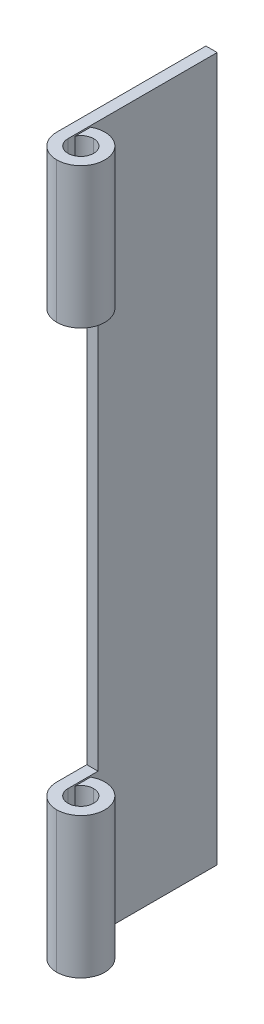
ISO-10303-21;
HEADER;
FILE_DESCRIPTION(('STEP AP214'),'2;1');
FILE_NAME('part.step','',(''),(''),'','','');
FILE_SCHEMA(('AUTOMOTIVE_DESIGN { 1 0 10303 214 1 1 1 1 }'));
ENDSEC;
DATA;
#1=APPLICATION_CONTEXT('core data for automotive mechanical design processes');
#2=APPLICATION_PROTOCOL_DEFINITION('international standard','automotive_design',2000,#1);
#3=PRODUCT_CONTEXT('',#1,'mechanical');
#4=PRODUCT('Part','Part','',(#3));
#5=PRODUCT_RELATED_PRODUCT_CATEGORY('part','',(#4));
#6=PRODUCT_DEFINITION_FORMATION('','',#4);
#7=PRODUCT_DEFINITION_CONTEXT('part definition',#1,'design');
#8=PRODUCT_DEFINITION('design','',#6,#7);
#9=PRODUCT_DEFINITION_SHAPE('','',#8);
#10=(LENGTH_UNIT() NAMED_UNIT(*) SI_UNIT(.MILLI.,.METRE.));
#11=(NAMED_UNIT(*) PLANE_ANGLE_UNIT() SI_UNIT($,.RADIAN.));
#12=(NAMED_UNIT(*) SI_UNIT($,.STERADIAN.) SOLID_ANGLE_UNIT());
#13=UNCERTAINTY_MEASURE_WITH_UNIT(LENGTH_MEASURE(1.E-05),#10,'distance_accuracy_value','');
#14=(GEOMETRIC_REPRESENTATION_CONTEXT(3) GLOBAL_UNCERTAINTY_ASSIGNED_CONTEXT((#13)) GLOBAL_UNIT_ASSIGNED_CONTEXT((#10,
#11,#12)) REPRESENTATION_CONTEXT('',''));
#15=CARTESIAN_POINT('',(0.,0.,0.));
#16=DIRECTION('',(0.,0.,1.));
#17=DIRECTION('',(1.,0.,0.));
#18=AXIS2_PLACEMENT_3D('',#15,#16,#17);
#19=CARTESIAN_POINT('',(4.3434,12.7,2.71018));
#20=DIRECTION('',(0.,1.,0.));
#21=DIRECTION('',(0.,0.,-1.));
#22=AXIS2_PLACEMENT_3D('',#19,#20,#21);
#23=PLANE('',#22);
#24=CARTESIAN_POINT('',(2.1717,12.7,0.));
#25=DIRECTION('',(0.,1.,0.));
#26=DIRECTION('',(0.,0.,1.));
#27=AXIS2_PLACEMENT_3D('',#24,#25,#26);
#28=CIRCLE('',#27,2.1717);
#29=CARTESIAN_POINT('',(0.,12.7,0.));
#30=VERTEX_POINT('',#29);
#31=CARTESIAN_POINT('',(2.1717,12.7,2.1717));
#32=VERTEX_POINT('',#31);
#33=EDGE_CURVE('E323',#30,#32,#28,.T.);
#34=ORIENTED_EDGE('',*,*,#33,.T.);
#35=CARTESIAN_POINT('',(2.1717,12.7,0.));
#36=DIRECTION('',(0.,1.,0.));
#37=DIRECTION('',(0.,0.,1.));
#38=AXIS2_PLACEMENT_3D('',#35,#36,#37);
#39=CIRCLE('',#38,2.1717);
#40=CARTESIAN_POINT('',(2.1717,12.7,-2.1717));
#41=VERTEX_POINT('',#40);
#42=EDGE_CURVE('E268',#32,#41,#39,.T.);
#43=ORIENTED_EDGE('',*,*,#42,.T.);
#44=CARTESIAN_POINT('',(2.1717,12.7,0.));
#45=DIRECTION('',(0.,1.,0.));
#46=DIRECTION('',(0.,0.,1.));
#47=AXIS2_PLACEMENT_3D('',#44,#45,#46);
#48=CIRCLE('',#47,2.1717);
#49=CARTESIAN_POINT('',(1.143,12.7,-1.9126048206569));
#50=VERTEX_POINT('',#49);
#51=EDGE_CURVE('E433',#41,#50,#48,.T.);
#52=ORIENTED_EDGE('',*,*,#51,.T.);
#53=DIRECTION('',(0.,0.,1.));
#54=VECTOR('',#53,1.);
#55=CARTESIAN_POINT('',(1.143,12.7,-1.91260482065692));
#56=LINE('',#55,#54);
#57=CARTESIAN_POINT('',(1.143,12.7,-0.526705610374527));
#58=VERTEX_POINT('',#57);
#59=EDGE_CURVE('E479',#50,#58,#56,.T.);
#60=ORIENTED_EDGE('',*,*,#59,.T.);
#61=CARTESIAN_POINT('',(2.1717,12.7,0.));
#62=DIRECTION('',(0.,-1.,0.));
#63=DIRECTION('',(0.,0.,1.));
#64=AXIS2_PLACEMENT_3D('',#61,#62,#63);
#65=CIRCLE('',#64,1.1557);
#66=CARTESIAN_POINT('',(2.1717,12.7,-1.1557));
#67=VERTEX_POINT('',#66);
#68=EDGE_CURVE('E225',#58,#67,#65,.T.);
#69=ORIENTED_EDGE('',*,*,#68,.T.);
#70=CARTESIAN_POINT('',(2.1717,12.7,0.));
#71=DIRECTION('',(0.,-1.,0.));
#72=DIRECTION('',(0.,0.,1.));
#73=AXIS2_PLACEMENT_3D('',#70,#71,#72);
#74=CIRCLE('',#73,1.1557);
#75=CARTESIAN_POINT('',(2.1717,12.7,1.1557));
#76=VERTEX_POINT('',#75);
#77=EDGE_CURVE('E239',#67,#76,#74,.T.);
#78=ORIENTED_EDGE('',*,*,#77,.T.);
#79=CARTESIAN_POINT('',(2.1717,12.7,0.));
#80=DIRECTION('',(0.,-1.,0.));
#81=DIRECTION('',(0.,0.,1.));
#82=AXIS2_PLACEMENT_3D('',#79,#80,#81);
#83=CIRCLE('',#82,1.1557);
#84=CARTESIAN_POINT('',(1.016,12.7,0.));
#85=VERTEX_POINT('',#84);
#86=EDGE_CURVE('E332',#76,#85,#83,.T.);
#87=ORIENTED_EDGE('',*,*,#86,.T.);
#88=DIRECTION('',(0.,0.,-1.));
#89=VECTOR('',#88,1.);
#90=CARTESIAN_POINT('',(1.016,12.7,-13.462));
#91=LINE('',#90,#89);
#92=CARTESIAN_POINT('',(1.016,12.7,-2.71018));
#93=VERTEX_POINT('',#92);
#94=EDGE_CURVE('E331',#85,#93,#91,.T.);
#95=ORIENTED_EDGE('',*,*,#94,.T.);
#96=DIRECTION('',(-1.,0.,0.));
#97=VECTOR('',#96,1.);
#98=CARTESIAN_POINT('',(4.3434,12.7,-2.71018));
#99=LINE('',#98,#97);
#100=CARTESIAN_POINT('',(0.,12.7,-2.71018));
#101=VERTEX_POINT('',#100);
#102=EDGE_CURVE('E11',#93,#101,#99,.T.);
#103=ORIENTED_EDGE('',*,*,#102,.T.);
#104=DIRECTION('',(0.,0.,-1.));
#105=VECTOR('',#104,1.);
#106=CARTESIAN_POINT('',(0.,12.7,2.71018));
#107=LINE('',#106,#105);
#108=EDGE_CURVE('E425',#30,#101,#107,.T.);
#109=ORIENTED_EDGE('',*,*,#108,.F.);
#110=EDGE_LOOP('',(#34,#43,#52,#60,#69,#78,#87,#95,#103,#109));
#111=FACE_BOUND('',#110,.T.);
#112=ADVANCED_FACE('F38',(#111),#23,.T.);
#113=CARTESIAN_POINT('',(4.3434,25.4,-2.71018));
#114=DIRECTION('',(0.,0.,1.));
#115=DIRECTION('',(0.,-1.,0.));
#116=AXIS2_PLACEMENT_3D('',#113,#114,#115);
#117=PLANE('',#116);
#118=DIRECTION('',(0.,1.,0.));
#119=VECTOR('',#118,1.);
#120=CARTESIAN_POINT('',(1.016,63.5,-2.71018));
#121=LINE('',#120,#119);
#122=CARTESIAN_POINT('',(1.016,50.8,-2.71018));
#123=VERTEX_POINT('',#122);
#124=EDGE_CURVE('E327',#93,#123,#121,.T.);
#125=ORIENTED_EDGE('',*,*,#124,.T.);
#126=DIRECTION('',(-1.,0.,0.));
#127=VECTOR('',#126,1.);
#128=CARTESIAN_POINT('',(4.3434,50.8,-2.71018));
#129=LINE('',#128,#127);
#130=CARTESIAN_POINT('',(0.,50.8,-2.71018));
#131=VERTEX_POINT('',#130);
#132=EDGE_CURVE('E49',#123,#131,#129,.T.);
#133=ORIENTED_EDGE('',*,*,#132,.T.);
#134=DIRECTION('',(0.,1.,0.));
#135=VECTOR('',#134,1.);
#136=CARTESIAN_POINT('',(0.,25.4,-2.71018));
#137=LINE('',#136,#135);
#138=EDGE_CURVE('E326',#101,#131,#137,.T.);
#139=ORIENTED_EDGE('',*,*,#138,.F.);
#140=ORIENTED_EDGE('',*,*,#102,.F.);
#141=EDGE_LOOP('',(#125,#133,#139,#140));
#142=FACE_BOUND('',#141,.T.);
#143=ADVANCED_FACE('F383',(#142),#117,.T.);
#144=CARTESIAN_POINT('',(4.3434,50.8,2.71018));
#145=DIRECTION('',(0.,-1.,0.));
#146=DIRECTION('',(0.,0.,-1.));
#147=AXIS2_PLACEMENT_3D('',#144,#145,#146);
#148=PLANE('',#147);
#149=DIRECTION('',(0.,0.,1.));
#150=VECTOR('',#149,1.);
#151=CARTESIAN_POINT('',(1.016,50.8,-13.462));
#152=LINE('',#151,#150);
#153=CARTESIAN_POINT('',(1.016,50.8,0.));
#154=VERTEX_POINT('',#153);
#155=EDGE_CURVE('E273',#123,#154,#152,.T.);
#156=ORIENTED_EDGE('',*,*,#155,.T.);
#157=CARTESIAN_POINT('',(2.1717,50.8,0.));
#158=DIRECTION('',(0.,1.,0.));
#159=DIRECTION('',(0.,0.,-1.));
#160=AXIS2_PLACEMENT_3D('',#157,#158,#159);
#161=CIRCLE('',#160,1.1557);
#162=CARTESIAN_POINT('',(2.1717,50.8,1.1557));
#163=VERTEX_POINT('',#162);
#164=EDGE_CURVE('E278',#154,#163,#161,.T.);
#165=ORIENTED_EDGE('',*,*,#164,.T.);
#166=CARTESIAN_POINT('',(2.1717,50.8,0.));
#167=DIRECTION('',(0.,1.,0.));
#168=DIRECTION('',(0.,0.,-1.));
#169=AXIS2_PLACEMENT_3D('',#166,#167,#168);
#170=CIRCLE('',#169,1.1557);
#171=CARTESIAN_POINT('',(2.1717,50.8,-1.1557));
#172=VERTEX_POINT('',#171);
#173=EDGE_CURVE('E337',#163,#172,#170,.T.);
#174=ORIENTED_EDGE('',*,*,#173,.T.);
#175=CARTESIAN_POINT('',(2.1717,50.8,0.));
#176=DIRECTION('',(0.,1.,0.));
#177=DIRECTION('',(0.,0.,-1.));
#178=AXIS2_PLACEMENT_3D('',#175,#176,#177);
#179=CIRCLE('',#178,1.1557);
#180=CARTESIAN_POINT('',(1.143,50.8,-0.526705610374527));
#181=VERTEX_POINT('',#180);
#182=EDGE_CURVE('E262',#172,#181,#179,.T.);
#183=ORIENTED_EDGE('',*,*,#182,.T.);
#184=DIRECTION('',(0.,0.,-1.));
#185=VECTOR('',#184,1.);
#186=CARTESIAN_POINT('',(1.143,50.8,-1.9126048206569));
#187=LINE('',#186,#185);
#188=CARTESIAN_POINT('',(1.143,50.8,-1.9126048206569));
#189=VERTEX_POINT('',#188);
#190=EDGE_CURVE('E345',#181,#189,#187,.T.);
#191=ORIENTED_EDGE('',*,*,#190,.T.);
#192=CARTESIAN_POINT('',(2.1717,50.8,0.));
#193=DIRECTION('',(0.,-1.,0.));
#194=DIRECTION('',(0.,0.,-1.));
#195=AXIS2_PLACEMENT_3D('',#192,#193,#194);
#196=CIRCLE('',#195,2.1717);
#197=CARTESIAN_POINT('',(2.1717,50.8,-2.1717));
#198=VERTEX_POINT('',#197);
#199=EDGE_CURVE('E269',#189,#198,#196,.T.);
#200=ORIENTED_EDGE('',*,*,#199,.T.);
#201=CARTESIAN_POINT('',(2.1717,50.8,0.));
#202=DIRECTION('',(0.,-1.,0.));
#203=DIRECTION('',(0.,0.,-1.));
#204=AXIS2_PLACEMENT_3D('',#201,#202,#203);
#205=CIRCLE('',#204,2.1717);
#206=CARTESIAN_POINT('',(2.1717,50.8,2.1717));
#207=VERTEX_POINT('',#206);
#208=EDGE_CURVE('E306',#198,#207,#205,.T.);
#209=ORIENTED_EDGE('',*,*,#208,.T.);
#210=CARTESIAN_POINT('',(2.1717,50.8,0.));
#211=DIRECTION('',(0.,-1.,0.));
#212=DIRECTION('',(0.,0.,-1.));
#213=AXIS2_PLACEMENT_3D('',#210,#211,#212);
#214=CIRCLE('',#213,2.1717);
#215=CARTESIAN_POINT('',(0.,50.8,0.));
#216=VERTEX_POINT('',#215);
#217=EDGE_CURVE('E350',#207,#216,#214,.T.);
#218=ORIENTED_EDGE('',*,*,#217,.T.);
#219=DIRECTION('',(0.,0.,1.));
#220=VECTOR('',#219,1.);
#221=CARTESIAN_POINT('',(0.,50.8,2.71018));
#222=LINE('',#221,#220);
#223=EDGE_CURVE('E498',#131,#216,#222,.T.);
#224=ORIENTED_EDGE('',*,*,#223,.F.);
#225=ORIENTED_EDGE('',*,*,#132,.F.);
#226=EDGE_LOOP('',(#156,#165,#174,#183,#191,#200,#209,#218,#224,#225));
#227=FACE_BOUND('',#226,.T.);
#228=ADVANCED_FACE('F359',(#227),#148,.T.);
#229=CARTESIAN_POINT('',(2.1717,0.,0.));
#230=DIRECTION('',(0.,1.,0.));
#231=DIRECTION('',(1.,0.,0.));
#232=AXIS2_PLACEMENT_3D('',#229,#230,#231);
#233=PLANE('',#232);
#234=DIRECTION('',(0.,0.,-1.));
#235=VECTOR('',#234,1.);
#236=CARTESIAN_POINT('',(1.016,0.,-13.462));
#237=LINE('',#236,#235);
#238=CARTESIAN_POINT('',(1.016,0.,0.));
#239=VERTEX_POINT('',#238);
#240=CARTESIAN_POINT('',(1.016,0.,-13.462));
#241=VERTEX_POINT('',#240);
#242=EDGE_CURVE('E260',#239,#241,#237,.T.);
#243=ORIENTED_EDGE('',*,*,#242,.F.);
#244=CARTESIAN_POINT('',(2.1717,0.,0.));
#245=DIRECTION('',(0.,-1.,0.));
#246=DIRECTION('',(0.,0.,1.));
#247=AXIS2_PLACEMENT_3D('',#244,#245,#246);
#248=CIRCLE('',#247,1.1557);
#249=CARTESIAN_POINT('',(2.1717,0.,1.1557));
#250=VERTEX_POINT('',#249);
#251=EDGE_CURVE('E231',#250,#239,#248,.T.);
#252=ORIENTED_EDGE('',*,*,#251,.F.);
#253=CARTESIAN_POINT('',(2.1717,0.,0.));
#254=DIRECTION('',(0.,-1.,0.));
#255=DIRECTION('',(0.,0.,1.));
#256=AXIS2_PLACEMENT_3D('',#253,#254,#255);
#257=CIRCLE('',#256,1.1557);
#258=CARTESIAN_POINT('',(2.1717,0.,-1.1557));
#259=VERTEX_POINT('',#258);
#260=EDGE_CURVE('E228',#259,#250,#257,.T.);
#261=ORIENTED_EDGE('',*,*,#260,.F.);
#262=CARTESIAN_POINT('',(2.1717,0.,0.));
#263=DIRECTION('',(0.,-1.,0.));
#264=DIRECTION('',(0.,0.,1.));
#265=AXIS2_PLACEMENT_3D('',#262,#263,#264);
#266=CIRCLE('',#265,1.1557);
#267=CARTESIAN_POINT('',(1.143,0.,-0.526705610374527));
#268=VERTEX_POINT('',#267);
#269=EDGE_CURVE('E214',#268,#259,#266,.T.);
#270=ORIENTED_EDGE('',*,*,#269,.F.);
#271=DIRECTION('',(0.,0.,1.));
#272=VECTOR('',#271,1.);
#273=CARTESIAN_POINT('',(1.143,0.,-1.9126048206569));
#274=LINE('',#273,#272);
#275=CARTESIAN_POINT('',(1.143,0.,-1.9126048206569));
#276=VERTEX_POINT('',#275);
#277=EDGE_CURVE('E346',#276,#268,#274,.T.);
#278=ORIENTED_EDGE('',*,*,#277,.F.);
#279=CARTESIAN_POINT('',(2.1717,0.,0.));
#280=DIRECTION('',(0.,1.,0.));
#281=DIRECTION('',(0.,0.,1.));
#282=AXIS2_PLACEMENT_3D('',#279,#280,#281);
#283=CIRCLE('',#282,2.1717);
#284=CARTESIAN_POINT('',(2.1717,0.,-2.1717));
#285=VERTEX_POINT('',#284);
#286=EDGE_CURVE('E274',#285,#276,#283,.T.);
#287=ORIENTED_EDGE('',*,*,#286,.F.);
#288=CARTESIAN_POINT('',(2.1717,0.,0.));
#289=DIRECTION('',(0.,1.,0.));
#290=DIRECTION('',(0.,0.,1.));
#291=AXIS2_PLACEMENT_3D('',#288,#289,#290);
#292=CIRCLE('',#291,2.1717);
#293=CARTESIAN_POINT('',(2.1717,0.,2.1717));
#294=VERTEX_POINT('',#293);
#295=EDGE_CURVE('E434',#294,#285,#292,.T.);
#296=ORIENTED_EDGE('',*,*,#295,.F.);
#297=CARTESIAN_POINT('',(2.1717,0.,0.));
#298=DIRECTION('',(0.,1.,0.));
#299=DIRECTION('',(0.,0.,1.));
#300=AXIS2_PLACEMENT_3D('',#297,#298,#299);
#301=CIRCLE('',#300,2.1717);
#302=CARTESIAN_POINT('',(0.,0.,0.));
#303=VERTEX_POINT('',#302);
#304=EDGE_CURVE('E321',#303,#294,#301,.T.);
#305=ORIENTED_EDGE('',*,*,#304,.F.);
#306=DIRECTION('',(0.,0.,1.));
#307=VECTOR('',#306,1.);
#308=CARTESIAN_POINT('',(0.,0.,-13.462));
#309=LINE('',#308,#307);
#310=CARTESIAN_POINT('',(0.,0.,-13.462));
#311=VERTEX_POINT('',#310);
#312=EDGE_CURVE('E319',#311,#303,#309,.T.);
#313=ORIENTED_EDGE('',*,*,#312,.F.);
#314=DIRECTION('',(-1.,0.,0.));
#315=VECTOR('',#314,1.);
#316=CARTESIAN_POINT('',(1.016,0.,-13.462));
#317=LINE('',#316,#315);
#318=EDGE_CURVE('E298',#241,#311,#317,.T.);
#319=ORIENTED_EDGE('',*,*,#318,.F.);
#320=EDGE_LOOP('',(#243,#252,#261,#270,#278,#287,#296,#305,#313,#319));
#321=FACE_BOUND('',#320,.T.);
#322=ADVANCED_FACE('F229',(#321),#233,.F.);
#323=CARTESIAN_POINT('',(2.1717,63.5,0.));
#324=DIRECTION('',(0.,1.,0.));
#325=DIRECTION('',(1.,0.,0.));
#326=AXIS2_PLACEMENT_3D('',#323,#324,#325);
#327=PLANE('',#326);
#328=DIRECTION('',(0.,0.,1.));
#329=VECTOR('',#328,1.);
#330=CARTESIAN_POINT('',(0.,63.5,-13.462));
#331=LINE('',#330,#329);
#332=CARTESIAN_POINT('',(0.,63.5,-13.462));
#333=VERTEX_POINT('',#332);
#334=CARTESIAN_POINT('',(0.,63.5,0.));
#335=VERTEX_POINT('',#334);
#336=EDGE_CURVE('E42',#333,#335,#331,.T.);
#337=ORIENTED_EDGE('',*,*,#336,.T.);
#338=CARTESIAN_POINT('',(2.1717,63.5,0.));
#339=DIRECTION('',(0.,1.,0.));
#340=DIRECTION('',(0.,0.,1.));
#341=AXIS2_PLACEMENT_3D('',#338,#339,#340);
#342=CIRCLE('',#341,2.1717);
#343=CARTESIAN_POINT('',(2.1717,63.5,2.1717));
#344=VERTEX_POINT('',#343);
#345=EDGE_CURVE('E207',#335,#344,#342,.T.);
#346=ORIENTED_EDGE('',*,*,#345,.T.);
#347=CARTESIAN_POINT('',(2.1717,63.5,0.));
#348=DIRECTION('',(0.,1.,0.));
#349=DIRECTION('',(0.,0.,1.));
#350=AXIS2_PLACEMENT_3D('',#347,#348,#349);
#351=CIRCLE('',#350,2.1717);
#352=CARTESIAN_POINT('',(2.1717,63.5,-2.1717));
#353=VERTEX_POINT('',#352);
#354=EDGE_CURVE('E236',#344,#353,#351,.T.);
#355=ORIENTED_EDGE('',*,*,#354,.T.);
#356=CARTESIAN_POINT('',(2.1717,63.5,0.));
#357=DIRECTION('',(0.,1.,0.));
#358=DIRECTION('',(0.,0.,1.));
#359=AXIS2_PLACEMENT_3D('',#356,#357,#358);
#360=CIRCLE('',#359,2.1717);
#361=CARTESIAN_POINT('',(1.143,63.5,-1.9126048206569));
#362=VERTEX_POINT('',#361);
#363=EDGE_CURVE('E411',#353,#362,#360,.T.);
#364=ORIENTED_EDGE('',*,*,#363,.T.);
#365=DIRECTION('',(0.,0.,1.));
#366=VECTOR('',#365,1.);
#367=CARTESIAN_POINT('',(1.143,63.5,-1.9126048206569));
#368=LINE('',#367,#366);
#369=CARTESIAN_POINT('',(1.143,63.5,-0.526705610374527));
#370=VERTEX_POINT('',#369);
#371=EDGE_CURVE('E252',#362,#370,#368,.T.);
#372=ORIENTED_EDGE('',*,*,#371,.T.);
#373=CARTESIAN_POINT('',(2.1717,63.5,0.));
#374=DIRECTION('',(0.,-1.,0.));
#375=DIRECTION('',(0.,0.,1.));
#376=AXIS2_PLACEMENT_3D('',#373,#374,#375);
#377=CIRCLE('',#376,1.1557);
#378=CARTESIAN_POINT('',(2.1717,63.5,-1.1557));
#379=VERTEX_POINT('',#378);
#380=EDGE_CURVE('E62',#370,#379,#377,.T.);
#381=ORIENTED_EDGE('',*,*,#380,.T.);
#382=CARTESIAN_POINT('',(2.1717,63.5,0.));
#383=DIRECTION('',(0.,-1.,0.));
#384=DIRECTION('',(0.,0.,1.));
#385=AXIS2_PLACEMENT_3D('',#382,#383,#384);
#386=CIRCLE('',#385,1.1557);
#387=CARTESIAN_POINT('',(2.1717,63.5,1.1557));
#388=VERTEX_POINT('',#387);
#389=EDGE_CURVE('E368',#379,#388,#386,.T.);
#390=ORIENTED_EDGE('',*,*,#389,.T.);
#391=CARTESIAN_POINT('',(2.1717,63.5,0.));
#392=DIRECTION('',(0.,-1.,0.));
#393=DIRECTION('',(0.,0.,1.));
#394=AXIS2_PLACEMENT_3D('',#391,#392,#393);
#395=CIRCLE('',#394,1.1557);
#396=CARTESIAN_POINT('',(1.016,63.5,0.));
#397=VERTEX_POINT('',#396);
#398=EDGE_CURVE('E279',#388,#397,#395,.T.);
#399=ORIENTED_EDGE('',*,*,#398,.T.);
#400=DIRECTION('',(0.,0.,-1.));
#401=VECTOR('',#400,1.);
#402=CARTESIAN_POINT('',(1.016,63.5,-13.462));
#403=LINE('',#402,#401);
#404=CARTESIAN_POINT('',(1.016,63.5,-13.462));
#405=VERTEX_POINT('',#404);
#406=EDGE_CURVE('E259',#397,#405,#403,.T.);
#407=ORIENTED_EDGE('',*,*,#406,.T.);
#408=DIRECTION('',(-1.,0.,0.));
#409=VECTOR('',#408,1.);
#410=CARTESIAN_POINT('',(1.016,63.5,-13.462));
#411=LINE('',#410,#409);
#412=EDGE_CURVE('E250',#405,#333,#411,.T.);
#413=ORIENTED_EDGE('',*,*,#412,.T.);
#414=EDGE_LOOP('',(#337,#346,#355,#364,#372,#381,#390,#399,#407,#413));
#415=FACE_BOUND('',#414,.T.);
#416=ADVANCED_FACE('F393',(#415),#327,.T.);
#417=CARTESIAN_POINT('',(1.016,63.5,-13.462));
#418=DIRECTION('',(0.,0.,1.));
#419=DIRECTION('',(1.,0.,0.));
#420=AXIS2_PLACEMENT_3D('',#417,#418,#419);
#421=PLANE('',#420);
#422=ORIENTED_EDGE('',*,*,#318,.T.);
#423=DIRECTION('',(0.,-1.,0.));
#424=VECTOR('',#423,1.);
#425=CARTESIAN_POINT('',(0.,63.5,-13.462));
#426=LINE('',#425,#424);
#427=EDGE_CURVE('E351',#333,#311,#426,.T.);
#428=ORIENTED_EDGE('',*,*,#427,.F.);
#429=ORIENTED_EDGE('',*,*,#412,.F.);
#430=DIRECTION('',(0.,-1.,0.));
#431=VECTOR('',#430,1.);
#432=CARTESIAN_POINT('',(1.016,63.5,-13.462));
#433=LINE('',#432,#431);
#434=EDGE_CURVE('E255',#405,#241,#433,.T.);
#435=ORIENTED_EDGE('',*,*,#434,.T.);
#436=EDGE_LOOP('',(#422,#428,#429,#435));
#437=FACE_BOUND('',#436,.T.);
#438=ADVANCED_FACE('F40',(#437),#421,.F.);
#439=CARTESIAN_POINT('',(2.1717,63.5,0.));
#440=DIRECTION('',(0.,-1.,0.));
#441=DIRECTION('',(0.,0.,-1.));
#442=AXIS2_PLACEMENT_3D('',#439,#440,#441);
#443=CYLINDRICAL_SURFACE('',#442,1.1557);
#444=DIRECTION('',(0.,-1.,0.));
#445=VECTOR('',#444,1.);
#446=CARTESIAN_POINT('',(2.1717,63.5,-1.1557));
#447=LINE('',#446,#445);
#448=EDGE_CURVE('E420',#379,#172,#447,.T.);
#449=ORIENTED_EDGE('',*,*,#448,.F.);
#450=ORIENTED_EDGE('',*,*,#380,.F.);
#451=DIRECTION('',(0.,-1.,0.));
#452=VECTOR('',#451,1.);
#453=CARTESIAN_POINT('',(1.143,63.5,-0.526705610374527));
#454=LINE('',#453,#452);
#455=EDGE_CURVE('E254',#370,#181,#454,.T.);
#456=ORIENTED_EDGE('',*,*,#455,.T.);
#457=ORIENTED_EDGE('',*,*,#182,.F.);
#458=EDGE_LOOP('',(#449,#450,#456,#457));
#459=FACE_BOUND('',#458,.T.);
#460=ADVANCED_FACE('F517',(#459),#443,.F.);
#461=CARTESIAN_POINT('',(2.1717,63.5,0.));
#462=DIRECTION('',(0.,-1.,0.));
#463=DIRECTION('',(0.,0.,-1.));
#464=AXIS2_PLACEMENT_3D('',#461,#462,#463);
#465=CYLINDRICAL_SURFACE('',#464,1.1557);
#466=DIRECTION('',(0.,-1.,0.));
#467=VECTOR('',#466,1.);
#468=CARTESIAN_POINT('',(2.1717,63.5,-1.1557));
#469=LINE('',#468,#467);
#470=EDGE_CURVE('E218',#67,#259,#469,.T.);
#471=ORIENTED_EDGE('',*,*,#470,.F.);
#472=ORIENTED_EDGE('',*,*,#68,.F.);
#473=DIRECTION('',(0.,-1.,0.));
#474=VECTOR('',#473,1.);
#475=CARTESIAN_POINT('',(1.143,63.5,-0.526705610374527));
#476=LINE('',#475,#474);
#477=EDGE_CURVE('E221',#58,#268,#476,.T.);
#478=ORIENTED_EDGE('',*,*,#477,.T.);
#479=ORIENTED_EDGE('',*,*,#269,.T.);
#480=EDGE_LOOP('',(#471,#472,#478,#479));
#481=FACE_BOUND('',#480,.T.);
#482=ADVANCED_FACE('F216',(#481),#465,.F.);
#483=CARTESIAN_POINT('',(1.143,63.5,-1.9126048206569));
#484=DIRECTION('',(1.,0.,0.));
#485=DIRECTION('',(0.,0.,-1.));
#486=AXIS2_PLACEMENT_3D('',#483,#484,#485);
#487=PLANE('',#486);
#488=ORIENTED_EDGE('',*,*,#190,.F.);
#489=ORIENTED_EDGE('',*,*,#455,.F.);
#490=ORIENTED_EDGE('',*,*,#371,.F.);
#491=DIRECTION('',(0.,-1.,0.));
#492=VECTOR('',#491,1.);
#493=CARTESIAN_POINT('',(1.143,63.5,-1.9126048206569));
#494=LINE('',#493,#492);
#495=EDGE_CURVE('E264',#362,#189,#494,.T.);
#496=ORIENTED_EDGE('',*,*,#495,.T.);
#497=EDGE_LOOP('',(#488,#489,#490,#496));
#498=FACE_BOUND('',#497,.T.);
#499=ADVANCED_FACE('F516',(#498),#487,.F.);
#500=CARTESIAN_POINT('',(1.143,63.5,-1.9126048206569));
#501=DIRECTION('',(1.,0.,0.));
#502=DIRECTION('',(0.,0.,-1.));
#503=AXIS2_PLACEMENT_3D('',#500,#501,#502);
#504=PLANE('',#503);
#505=ORIENTED_EDGE('',*,*,#59,.F.);
#506=DIRECTION('',(0.,-1.,0.));
#507=VECTOR('',#506,1.);
#508=CARTESIAN_POINT('',(1.143,63.5,-1.9126048206569));
#509=LINE('',#508,#507);
#510=EDGE_CURVE('E270',#50,#276,#509,.T.);
#511=ORIENTED_EDGE('',*,*,#510,.T.);
#512=ORIENTED_EDGE('',*,*,#277,.T.);
#513=ORIENTED_EDGE('',*,*,#477,.F.);
#514=EDGE_LOOP('',(#505,#511,#512,#513));
#515=FACE_BOUND('',#514,.T.);
#516=ADVANCED_FACE('F543',(#515),#504,.F.);
#517=CARTESIAN_POINT('',(2.1717,63.5,0.));
#518=DIRECTION('',(0.,-1.,0.));
#519=DIRECTION('',(0.,0.,-1.));
#520=AXIS2_PLACEMENT_3D('',#517,#518,#519);
#521=CYLINDRICAL_SURFACE('',#520,2.1717);
#522=DIRECTION('',(0.,-1.,0.));
#523=VECTOR('',#522,1.);
#524=CARTESIAN_POINT('',(2.1717,63.5,2.1717));
#525=LINE('',#524,#523);
#526=EDGE_CURVE('E300',#344,#207,#525,.T.);
#527=ORIENTED_EDGE('',*,*,#526,.F.);
#528=ORIENTED_EDGE('',*,*,#345,.F.);
#529=DIRECTION('',(0.,-1.,0.));
#530=VECTOR('',#529,1.);
#531=CARTESIAN_POINT('',(0.,63.5,0.));
#532=LINE('',#531,#530);
#533=EDGE_CURVE('E501',#335,#216,#532,.T.);
#534=ORIENTED_EDGE('',*,*,#533,.T.);
#535=ORIENTED_EDGE('',*,*,#217,.F.);
#536=EDGE_LOOP('',(#527,#528,#534,#535));
#537=FACE_BOUND('',#536,.T.);
#538=ADVANCED_FACE('F537',(#537),#521,.T.);
#539=CARTESIAN_POINT('',(2.1717,63.5,0.));
#540=DIRECTION('',(0.,-1.,0.));
#541=DIRECTION('',(0.,0.,-1.));
#542=AXIS2_PLACEMENT_3D('',#539,#540,#541);
#543=CYLINDRICAL_SURFACE('',#542,2.1717);
#544=DIRECTION('',(0.,-1.,0.));
#545=VECTOR('',#544,1.);
#546=CARTESIAN_POINT('',(2.1717,63.5,2.1717));
#547=LINE('',#546,#545);
#548=EDGE_CURVE('E461',#32,#294,#547,.T.);
#549=ORIENTED_EDGE('',*,*,#548,.F.);
#550=ORIENTED_EDGE('',*,*,#33,.F.);
#551=DIRECTION('',(0.,-1.,0.));
#552=VECTOR('',#551,1.);
#553=CARTESIAN_POINT('',(0.,63.5,0.));
#554=LINE('',#553,#552);
#555=EDGE_CURVE('E438',#30,#303,#554,.T.);
#556=ORIENTED_EDGE('',*,*,#555,.T.);
#557=ORIENTED_EDGE('',*,*,#304,.T.);
#558=EDGE_LOOP('',(#549,#550,#556,#557));
#559=FACE_BOUND('',#558,.T.);
#560=ADVANCED_FACE('F460',(#559),#543,.T.);
#561=CARTESIAN_POINT('',(0.,63.5,-13.462));
#562=DIRECTION('',(1.,0.,0.));
#563=DIRECTION('',(0.,1.,0.));
#564=AXIS2_PLACEMENT_3D('',#561,#562,#563);
#565=PLANE('',#564);
#566=ORIENTED_EDGE('',*,*,#138,.T.);
#567=ORIENTED_EDGE('',*,*,#223,.T.);
#568=ORIENTED_EDGE('',*,*,#533,.F.);
#569=ORIENTED_EDGE('',*,*,#336,.F.);
#570=ORIENTED_EDGE('',*,*,#427,.T.);
#571=ORIENTED_EDGE('',*,*,#312,.T.);
#572=ORIENTED_EDGE('',*,*,#555,.F.);
#573=ORIENTED_EDGE('',*,*,#108,.T.);
#574=EDGE_LOOP('',(#566,#567,#568,#569,#570,#571,#572,#573));
#575=FACE_BOUND('',#574,.T.);
#576=ADVANCED_FACE('F452',(#575),#565,.F.);
#577=CARTESIAN_POINT('',(1.016,63.5,-13.462));
#578=DIRECTION('',(-1.,0.,0.));
#579=DIRECTION('',(0.,0.,1.));
#580=AXIS2_PLACEMENT_3D('',#577,#578,#579);
#581=PLANE('',#580);
#582=ORIENTED_EDGE('',*,*,#155,.F.);
#583=ORIENTED_EDGE('',*,*,#124,.F.);
#584=ORIENTED_EDGE('',*,*,#94,.F.);
#585=DIRECTION('',(0.,-1.,0.));
#586=VECTOR('',#585,1.);
#587=CARTESIAN_POINT('',(1.016,63.5,0.));
#588=LINE('',#587,#586);
#589=EDGE_CURVE('E246',#85,#239,#588,.T.);
#590=ORIENTED_EDGE('',*,*,#589,.T.);
#591=ORIENTED_EDGE('',*,*,#242,.T.);
#592=ORIENTED_EDGE('',*,*,#434,.F.);
#593=ORIENTED_EDGE('',*,*,#406,.F.);
#594=DIRECTION('',(0.,-1.,0.));
#595=VECTOR('',#594,1.);
#596=CARTESIAN_POINT('',(1.016,63.5,0.));
#597=LINE('',#596,#595);
#598=EDGE_CURVE('E288',#397,#154,#597,.T.);
#599=ORIENTED_EDGE('',*,*,#598,.T.);
#600=EDGE_LOOP('',(#582,#583,#584,#590,#591,#592,#593,#599));
#601=FACE_BOUND('',#600,.T.);
#602=ADVANCED_FACE('F365',(#601),#581,.F.);
#603=CARTESIAN_POINT('',(2.1717,63.5,0.));
#604=DIRECTION('',(0.,-1.,0.));
#605=DIRECTION('',(0.,0.,-1.));
#606=AXIS2_PLACEMENT_3D('',#603,#604,#605);
#607=CYLINDRICAL_SURFACE('',#606,2.1717);
#608=ORIENTED_EDGE('',*,*,#51,.F.);
#609=DIRECTION('',(0.,-1.,0.));
#610=VECTOR('',#609,1.);
#611=CARTESIAN_POINT('',(2.1717,63.5,-2.1717));
#612=LINE('',#611,#610);
#613=EDGE_CURVE('E429',#41,#285,#612,.T.);
#614=ORIENTED_EDGE('',*,*,#613,.T.);
#615=ORIENTED_EDGE('',*,*,#286,.T.);
#616=ORIENTED_EDGE('',*,*,#510,.F.);
#617=EDGE_LOOP('',(#608,#614,#615,#616));
#618=FACE_BOUND('',#617,.T.);
#619=ADVANCED_FACE('F546',(#618),#607,.T.);
#620=CARTESIAN_POINT('',(2.1717,63.5,0.));
#621=DIRECTION('',(0.,-1.,0.));
#622=DIRECTION('',(0.,0.,-1.));
#623=AXIS2_PLACEMENT_3D('',#620,#621,#622);
#624=CYLINDRICAL_SURFACE('',#623,2.1717);
#625=ORIENTED_EDGE('',*,*,#42,.F.);
#626=ORIENTED_EDGE('',*,*,#548,.T.);
#627=ORIENTED_EDGE('',*,*,#295,.T.);
#628=ORIENTED_EDGE('',*,*,#613,.F.);
#629=EDGE_LOOP('',(#625,#626,#627,#628));
#630=FACE_BOUND('',#629,.T.);
#631=ADVANCED_FACE('F404',(#630),#624,.T.);
#632=CARTESIAN_POINT('',(2.1717,63.5,0.));
#633=DIRECTION('',(0.,-1.,0.));
#634=DIRECTION('',(0.,0.,-1.));
#635=AXIS2_PLACEMENT_3D('',#632,#633,#634);
#636=CYLINDRICAL_SURFACE('',#635,2.1717);
#637=ORIENTED_EDGE('',*,*,#363,.F.);
#638=DIRECTION('',(0.,-1.,0.));
#639=VECTOR('',#638,1.);
#640=CARTESIAN_POINT('',(2.1717,63.5,-2.1717));
#641=LINE('',#640,#639);
#642=EDGE_CURVE('E315',#353,#198,#641,.T.);
#643=ORIENTED_EDGE('',*,*,#642,.T.);
#644=ORIENTED_EDGE('',*,*,#199,.F.);
#645=ORIENTED_EDGE('',*,*,#495,.F.);
#646=EDGE_LOOP('',(#637,#643,#644,#645));
#647=FACE_BOUND('',#646,.T.);
#648=ADVANCED_FACE('F398',(#647),#636,.T.);
#649=CARTESIAN_POINT('',(2.1717,63.5,0.));
#650=DIRECTION('',(0.,-1.,0.));
#651=DIRECTION('',(0.,0.,-1.));
#652=AXIS2_PLACEMENT_3D('',#649,#650,#651);
#653=CYLINDRICAL_SURFACE('',#652,2.1717);
#654=ORIENTED_EDGE('',*,*,#354,.F.);
#655=ORIENTED_EDGE('',*,*,#526,.T.);
#656=ORIENTED_EDGE('',*,*,#208,.F.);
#657=ORIENTED_EDGE('',*,*,#642,.F.);
#658=EDGE_LOOP('',(#654,#655,#656,#657));
#659=FACE_BOUND('',#658,.T.);
#660=ADVANCED_FACE('F396',(#659),#653,.T.);
#661=CARTESIAN_POINT('',(2.1717,63.5,0.));
#662=DIRECTION('',(0.,-1.,0.));
#663=DIRECTION('',(0.,0.,-1.));
#664=AXIS2_PLACEMENT_3D('',#661,#662,#663);
#665=CYLINDRICAL_SURFACE('',#664,1.1557);
#666=DIRECTION('',(0.,-1.,0.));
#667=VECTOR('',#666,1.);
#668=CARTESIAN_POINT('',(2.1717,63.5,1.1557));
#669=LINE('',#668,#667);
#670=EDGE_CURVE('E336',#76,#250,#669,.T.);
#671=ORIENTED_EDGE('',*,*,#670,.F.);
#672=ORIENTED_EDGE('',*,*,#77,.F.);
#673=ORIENTED_EDGE('',*,*,#470,.T.);
#674=ORIENTED_EDGE('',*,*,#260,.T.);
#675=EDGE_LOOP('',(#671,#672,#673,#674));
#676=FACE_BOUND('',#675,.T.);
#677=ADVANCED_FACE('F238',(#676),#665,.F.);
#678=CARTESIAN_POINT('',(2.1717,63.5,0.));
#679=DIRECTION('',(0.,-1.,0.));
#680=DIRECTION('',(0.,0.,-1.));
#681=AXIS2_PLACEMENT_3D('',#678,#679,#680);
#682=CYLINDRICAL_SURFACE('',#681,1.1557);
#683=ORIENTED_EDGE('',*,*,#86,.F.);
#684=ORIENTED_EDGE('',*,*,#670,.T.);
#685=ORIENTED_EDGE('',*,*,#251,.T.);
#686=ORIENTED_EDGE('',*,*,#589,.F.);
#687=EDGE_LOOP('',(#683,#684,#685,#686));
#688=FACE_BOUND('',#687,.T.);
#689=ADVANCED_FACE('F377',(#688),#682,.F.);
#690=CARTESIAN_POINT('',(2.1717,63.5,0.));
#691=DIRECTION('',(0.,-1.,0.));
#692=DIRECTION('',(0.,0.,-1.));
#693=AXIS2_PLACEMENT_3D('',#690,#691,#692);
#694=CYLINDRICAL_SURFACE('',#693,1.1557);
#695=DIRECTION('',(0.,-1.,0.));
#696=VECTOR('',#695,1.);
#697=CARTESIAN_POINT('',(2.1717,63.5,1.1557));
#698=LINE('',#697,#696);
#699=EDGE_CURVE('E275',#388,#163,#698,.T.);
#700=ORIENTED_EDGE('',*,*,#699,.F.);
#701=ORIENTED_EDGE('',*,*,#389,.F.);
#702=ORIENTED_EDGE('',*,*,#448,.T.);
#703=ORIENTED_EDGE('',*,*,#173,.F.);
#704=EDGE_LOOP('',(#700,#701,#702,#703));
#705=FACE_BOUND('',#704,.T.);
#706=ADVANCED_FACE('F372',(#705),#694,.F.);
#707=CARTESIAN_POINT('',(2.1717,63.5,0.));
#708=DIRECTION('',(0.,-1.,0.));
#709=DIRECTION('',(0.,0.,-1.));
#710=AXIS2_PLACEMENT_3D('',#707,#708,#709);
#711=CYLINDRICAL_SURFACE('',#710,1.1557);
#712=ORIENTED_EDGE('',*,*,#398,.F.);
#713=ORIENTED_EDGE('',*,*,#699,.T.);
#714=ORIENTED_EDGE('',*,*,#164,.F.);
#715=ORIENTED_EDGE('',*,*,#598,.F.);
#716=EDGE_LOOP('',(#712,#713,#714,#715));
#717=FACE_BOUND('',#716,.T.);
#718=ADVANCED_FACE('F370',(#717),#711,.F.);
#719=CLOSED_SHELL('',(#112,#143,#228,#322,#416,#438,#460,#482,#499,#516,#538,#560,#576,#602,
#619,#631,#648,#660,#677,#689,#706,#718));
#720=MANIFOLD_SOLID_BREP('B2',#719);
#721=ADVANCED_BREP_SHAPE_REPRESENTATION('',(#18,#720),#14);
#722=SHAPE_DEFINITION_REPRESENTATION(#9,#721);
ENDSEC;
END-ISO-10303-21;
